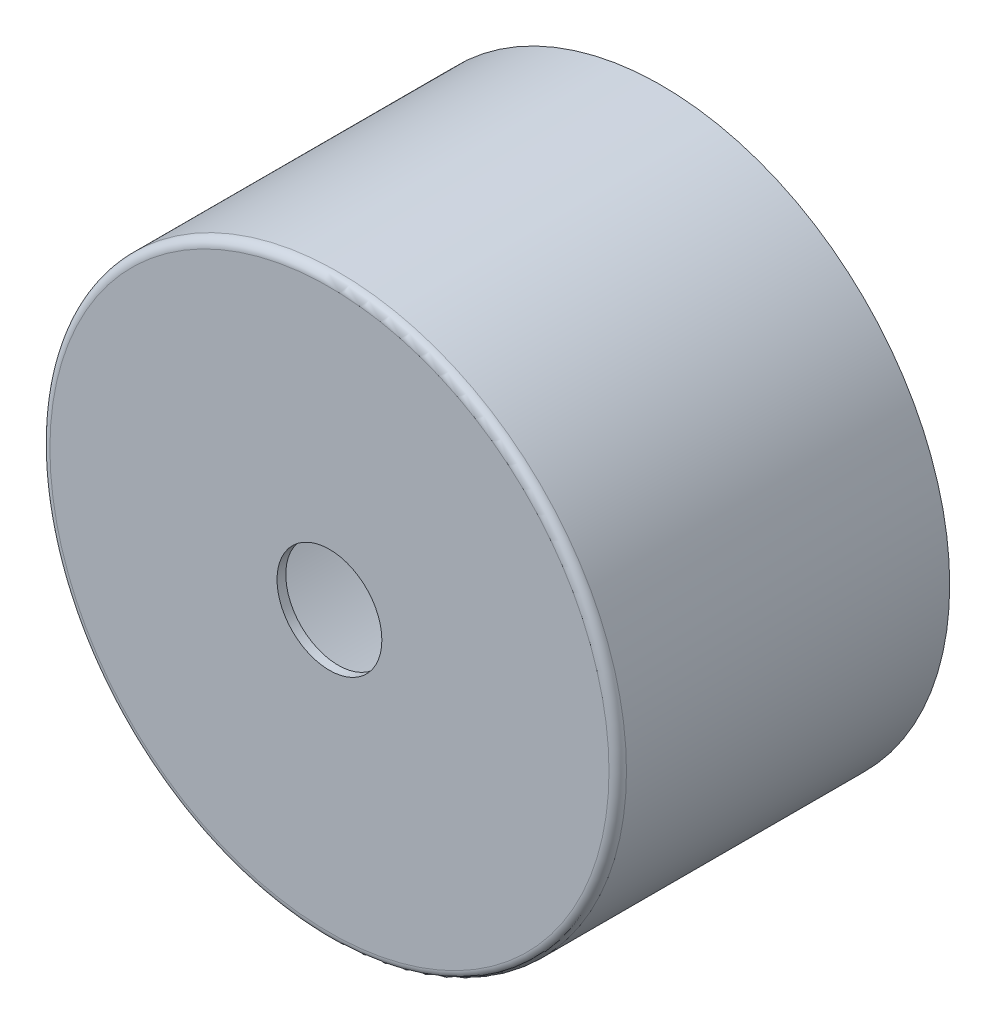
ISO-10303-21;
HEADER;
FILE_DESCRIPTION(('STEP AP214'),'2;1');
FILE_NAME('part.step','',(''),(''),'','','');
FILE_SCHEMA(('AUTOMOTIVE_DESIGN { 1 0 10303 214 1 1 1 1 }'));
ENDSEC;
DATA;
#1=APPLICATION_CONTEXT('core data for automotive mechanical design processes');
#2=APPLICATION_PROTOCOL_DEFINITION('international standard','automotive_design',2000,#1);
#3=PRODUCT_CONTEXT('',#1,'mechanical');
#4=PRODUCT('Part','Part','',(#3));
#5=PRODUCT_RELATED_PRODUCT_CATEGORY('part','',(#4));
#6=PRODUCT_DEFINITION_FORMATION('','',#4);
#7=PRODUCT_DEFINITION_CONTEXT('part definition',#1,'design');
#8=PRODUCT_DEFINITION('design','',#6,#7);
#9=PRODUCT_DEFINITION_SHAPE('','',#8);
#10=(LENGTH_UNIT() NAMED_UNIT(*) SI_UNIT(.MILLI.,.METRE.));
#11=(NAMED_UNIT(*) PLANE_ANGLE_UNIT() SI_UNIT($,.RADIAN.));
#12=(NAMED_UNIT(*) SI_UNIT($,.STERADIAN.) SOLID_ANGLE_UNIT());
#13=UNCERTAINTY_MEASURE_WITH_UNIT(LENGTH_MEASURE(1.E-05),#10,'distance_accuracy_value','');
#14=(GEOMETRIC_REPRESENTATION_CONTEXT(3) GLOBAL_UNCERTAINTY_ASSIGNED_CONTEXT((#13)) GLOBAL_UNIT_ASSIGNED_CONTEXT((#10,
#11,#12)) REPRESENTATION_CONTEXT('',''));
#15=CARTESIAN_POINT('',(0.,0.,0.));
#16=DIRECTION('',(0.,0.,1.));
#17=DIRECTION('',(1.,0.,0.));
#18=AXIS2_PLACEMENT_3D('',#15,#16,#17);
#19=CARTESIAN_POINT('',(0.,0.,-19.));
#20=DIRECTION('',(0.,0.,1.));
#21=DIRECTION('',(1.,0.,0.));
#22=AXIS2_PLACEMENT_3D('',#19,#20,#21);
#23=CYLINDRICAL_SURFACE('',#22,16.5);
#24=CARTESIAN_POINT('',(0.,0.,-0.5));
#25=DIRECTION('',(0.,0.,1.));
#26=DIRECTION('',(1.,0.,0.));
#27=AXIS2_PLACEMENT_3D('',#24,#25,#26);
#28=CIRCLE('',#27,16.5);
#29=CARTESIAN_POINT('',(16.5,0.,-0.5));
#30=VERTEX_POINT('',#29);
#31=EDGE_CURVE('E10',#30,#30,#28,.F.);
#32=ORIENTED_EDGE('',*,*,#31,.T.);
#33=EDGE_LOOP('',(#32));
#34=FACE_BOUND('',#33,.T.);
#35=CARTESIAN_POINT('',(0.,0.,-19.));
#36=DIRECTION('',(0.,0.,1.));
#37=DIRECTION('',(1.,0.,0.));
#38=AXIS2_PLACEMENT_3D('',#35,#36,#37);
#39=CIRCLE('',#38,16.5);
#40=CARTESIAN_POINT('',(16.5,0.,-19.));
#41=VERTEX_POINT('',#40);
#42=EDGE_CURVE('E43',#41,#41,#39,.T.);
#43=ORIENTED_EDGE('',*,*,#42,.T.);
#44=EDGE_LOOP('',(#43));
#45=FACE_BOUND('',#44,.T.);
#46=ADVANCED_FACE('F32',(#34,#45),#23,.T.);
#47=CARTESIAN_POINT('',(0.,0.,-19.));
#48=DIRECTION('',(0.,0.,1.));
#49=DIRECTION('',(1.,0.,0.));
#50=AXIS2_PLACEMENT_3D('',#47,#48,#49);
#51=PLANE('',#50);
#52=CARTESIAN_POINT('',(0.,0.,-19.));
#53=DIRECTION('',(0.,0.,1.));
#54=DIRECTION('',(1.,0.,0.));
#55=AXIS2_PLACEMENT_3D('',#52,#53,#54);
#56=CIRCLE('',#55,16.);
#57=CARTESIAN_POINT('',(16.,0.,-19.));
#58=VERTEX_POINT('',#57);
#59=EDGE_CURVE('E47',#58,#58,#56,.T.);
#60=ORIENTED_EDGE('',*,*,#59,.T.);
#61=EDGE_LOOP('',(#60));
#62=FACE_BOUND('',#61,.T.);
#63=ORIENTED_EDGE('',*,*,#42,.F.);
#64=EDGE_LOOP('',(#63));
#65=FACE_BOUND('',#64,.T.);
#66=ADVANCED_FACE('F68',(#62,#65),#51,.F.);
#67=CARTESIAN_POINT('',(0.,0.,0.));
#68=DIRECTION('',(0.,0.,1.));
#69=DIRECTION('',(1.,0.,0.));
#70=AXIS2_PLACEMENT_3D('',#67,#68,#69);
#71=PLANE('',#70);
#72=CARTESIAN_POINT('',(0.,0.,0.));
#73=DIRECTION('',(0.,0.,1.));
#74=DIRECTION('',(1.,0.,0.));
#75=AXIS2_PLACEMENT_3D('',#72,#73,#74);
#76=CIRCLE('',#75,16.);
#77=CARTESIAN_POINT('',(16.,0.,0.));
#78=VERTEX_POINT('',#77);
#79=EDGE_CURVE('E39',#78,#78,#76,.T.);
#80=ORIENTED_EDGE('',*,*,#79,.T.);
#81=EDGE_LOOP('',(#80));
#82=FACE_BOUND('',#81,.T.);
#83=CARTESIAN_POINT('',(0.,0.,0.));
#84=DIRECTION('',(0.,0.,1.));
#85=DIRECTION('',(1.,0.,0.));
#86=AXIS2_PLACEMENT_3D('',#83,#84,#85);
#87=CIRCLE('',#86,3.);
#88=CARTESIAN_POINT('',(3.,0.,0.));
#89=VERTEX_POINT('',#88);
#90=EDGE_CURVE('E53',#89,#89,#87,.T.);
#91=ORIENTED_EDGE('',*,*,#90,.F.);
#92=EDGE_LOOP('',(#91));
#93=FACE_BOUND('',#92,.T.);
#94=ADVANCED_FACE('F65',(#82,#93),#71,.T.);
#95=CARTESIAN_POINT('',(0.,0.,-19.));
#96=DIRECTION('',(0.,0.,1.));
#97=DIRECTION('',(1.,0.,0.));
#98=AXIS2_PLACEMENT_3D('',#95,#96,#97);
#99=CYLINDRICAL_SURFACE('',#98,16.);
#100=ORIENTED_EDGE('',*,*,#59,.F.);
#101=EDGE_LOOP('',(#100));
#102=FACE_BOUND('',#101,.T.);
#103=CARTESIAN_POINT('',(0.,0.,-0.5));
#104=DIRECTION('',(0.,0.,1.));
#105=DIRECTION('',(1.,0.,0.));
#106=AXIS2_PLACEMENT_3D('',#103,#104,#105);
#107=CIRCLE('',#106,16.);
#108=CARTESIAN_POINT('',(16.,0.,-0.5));
#109=VERTEX_POINT('',#108);
#110=EDGE_CURVE('E52',#109,#109,#107,.T.);
#111=ORIENTED_EDGE('',*,*,#110,.T.);
#112=EDGE_LOOP('',(#111));
#113=FACE_BOUND('',#112,.T.);
#114=ADVANCED_FACE('F67',(#102,#113),#99,.F.);
#115=CARTESIAN_POINT('',(0.,0.,-0.5));
#116=DIRECTION('',(0.,0.,1.));
#117=DIRECTION('',(1.,0.,0.));
#118=AXIS2_PLACEMENT_3D('',#115,#116,#117);
#119=PLANE('',#118);
#120=CARTESIAN_POINT('',(0.,0.,-0.5));
#121=DIRECTION('',(0.,0.,1.));
#122=DIRECTION('',(1.,0.,0.));
#123=AXIS2_PLACEMENT_3D('',#120,#121,#122);
#124=CIRCLE('',#123,3.);
#125=CARTESIAN_POINT('',(3.,0.,-0.5));
#126=VERTEX_POINT('',#125);
#127=EDGE_CURVE('E50',#126,#126,#124,.T.);
#128=ORIENTED_EDGE('',*,*,#127,.T.);
#129=EDGE_LOOP('',(#128));
#130=FACE_BOUND('',#129,.T.);
#131=ORIENTED_EDGE('',*,*,#110,.F.);
#132=EDGE_LOOP('',(#131));
#133=FACE_BOUND('',#132,.T.);
#134=ADVANCED_FACE('F74',(#130,#133),#119,.F.);
#135=CARTESIAN_POINT('',(0.,0.,-19.));
#136=DIRECTION('',(0.,0.,1.));
#137=DIRECTION('',(1.,0.,0.));
#138=AXIS2_PLACEMENT_3D('',#135,#136,#137);
#139=CYLINDRICAL_SURFACE('',#138,3.);
#140=ORIENTED_EDGE('',*,*,#90,.T.);
#141=EDGE_LOOP('',(#140));
#142=FACE_BOUND('',#141,.T.);
#143=ORIENTED_EDGE('',*,*,#127,.F.);
#144=EDGE_LOOP('',(#143));
#145=FACE_BOUND('',#144,.T.);
#146=ADVANCED_FACE('F62',(#142,#145),#139,.F.);
#147=CARTESIAN_POINT('',(0.,0.,-0.5));
#148=DIRECTION('',(0.,0.,1.));
#149=DIRECTION('',(1.,0.,0.));
#150=AXIS2_PLACEMENT_3D('',#147,#148,#149);
#151=TOROIDAL_SURFACE('',#150,16.,0.5);
#152=ORIENTED_EDGE('',*,*,#31,.F.);
#153=EDGE_LOOP('',(#152));
#154=FACE_BOUND('',#153,.T.);
#155=ORIENTED_EDGE('',*,*,#79,.F.);
#156=EDGE_LOOP('',(#155));
#157=FACE_BOUND('',#156,.T.);
#158=ADVANCED_FACE('F34',(#154,#157),#151,.T.);
#159=CLOSED_SHELL('',(#46,#66,#94,#114,#134,#146,#158));
#160=MANIFOLD_SOLID_BREP('B2',#159);
#161=ADVANCED_BREP_SHAPE_REPRESENTATION('',(#18,#160),#14);
#162=SHAPE_DEFINITION_REPRESENTATION(#9,#161);
ENDSEC;
END-ISO-10303-21;
